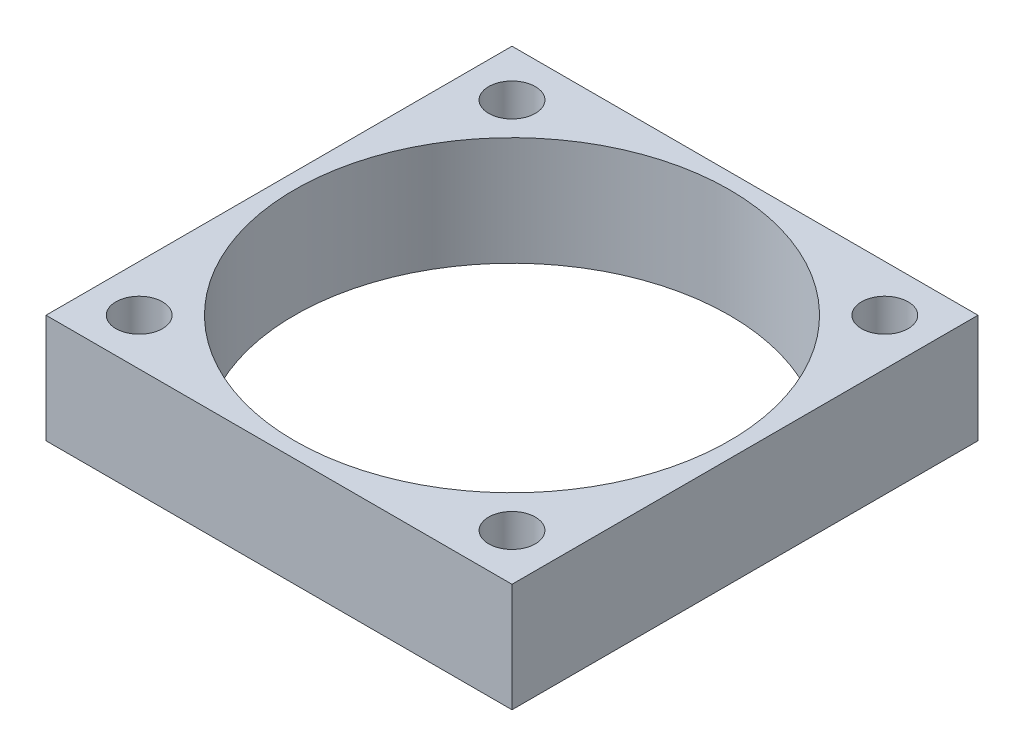
ISO-10303-21;
HEADER;
FILE_DESCRIPTION(('STEP AP214'),'2;1');
FILE_NAME('part.step','',(''),(''),'','','');
FILE_SCHEMA(('AUTOMOTIVE_DESIGN { 1 0 10303 214 1 1 1 1 }'));
ENDSEC;
DATA;
#1=APPLICATION_CONTEXT('core data for automotive mechanical design processes');
#2=APPLICATION_PROTOCOL_DEFINITION('international standard','automotive_design',2000,#1);
#3=PRODUCT_CONTEXT('',#1,'mechanical');
#4=PRODUCT('Part','Part','',(#3));
#5=PRODUCT_RELATED_PRODUCT_CATEGORY('part','',(#4));
#6=PRODUCT_DEFINITION_FORMATION('','',#4);
#7=PRODUCT_DEFINITION_CONTEXT('part definition',#1,'design');
#8=PRODUCT_DEFINITION('design','',#6,#7);
#9=PRODUCT_DEFINITION_SHAPE('','',#8);
#10=(LENGTH_UNIT() NAMED_UNIT(*) SI_UNIT(.MILLI.,.METRE.));
#11=(NAMED_UNIT(*) PLANE_ANGLE_UNIT() SI_UNIT($,.RADIAN.));
#12=(NAMED_UNIT(*) SI_UNIT($,.STERADIAN.) SOLID_ANGLE_UNIT());
#13=UNCERTAINTY_MEASURE_WITH_UNIT(LENGTH_MEASURE(1.E-05),#10,'distance_accuracy_value','');
#14=(GEOMETRIC_REPRESENTATION_CONTEXT(3) GLOBAL_UNCERTAINTY_ASSIGNED_CONTEXT((#13)) GLOBAL_UNIT_ASSIGNED_CONTEXT((#10,
#11,#12)) REPRESENTATION_CONTEXT('',''));
#15=CARTESIAN_POINT('',(0.,0.,0.));
#16=DIRECTION('',(0.,0.,1.));
#17=DIRECTION('',(1.,0.,0.));
#18=AXIS2_PLACEMENT_3D('',#15,#16,#17);
#19=CARTESIAN_POINT('',(0.,7.,0.));
#20=DIRECTION('',(0.,1.,0.));
#21=DIRECTION('',(0.,0.,1.));
#22=AXIS2_PLACEMENT_3D('',#19,#20,#21);
#23=PLANE('',#22);
#24=CARTESIAN_POINT('',(13.1600000000004,7.,11.2399999999996));
#25=DIRECTION('',(0.,1.,0.));
#26=DIRECTION('',(0.,0.,1.));
#27=AXIS2_PLACEMENT_3D('',#24,#25,#26);
#28=CIRCLE('',#27,1.5);
#29=CARTESIAN_POINT('',(13.1600000000004,7.,12.7399999999996));
#30=VERTEX_POINT('',#29);
#31=EDGE_CURVE('E150',#30,#30,#28,.T.);
#32=ORIENTED_EDGE('',*,*,#31,.F.);
#33=EDGE_LOOP('',(#32));
#34=FACE_BOUND('',#33,.T.);
#35=CARTESIAN_POINT('',(1.16,7.,-0.75999999999999));
#36=DIRECTION('',(0.,1.,0.));
#37=DIRECTION('',(0.,0.,1.));
#38=AXIS2_PLACEMENT_3D('',#35,#36,#37);
#39=CIRCLE('',#38,14.);
#40=CARTESIAN_POINT('',(1.16,7.,13.24));
#41=VERTEX_POINT('',#40);
#42=EDGE_CURVE('E134',#41,#41,#39,.T.);
#43=ORIENTED_EDGE('',*,*,#42,.F.);
#44=EDGE_LOOP('',(#43));
#45=FACE_BOUND('',#44,.T.);
#46=DIRECTION('',(0.,0.,1.));
#47=VECTOR('',#46,1.);
#48=CARTESIAN_POINT('',(-13.84,7.,-15.76));
#49=LINE('',#48,#47);
#50=CARTESIAN_POINT('',(-13.84,7.,-15.76));
#51=VERTEX_POINT('',#50);
#52=CARTESIAN_POINT('',(-13.84,7.,14.24));
#53=VERTEX_POINT('',#52);
#54=EDGE_CURVE('E92',#51,#53,#49,.T.);
#55=ORIENTED_EDGE('',*,*,#54,.T.);
#56=DIRECTION('',(1.,0.,0.));
#57=VECTOR('',#56,1.);
#58=CARTESIAN_POINT('',(-13.84,7.,14.24));
#59=LINE('',#58,#57);
#60=CARTESIAN_POINT('',(16.16,7.,14.24));
#61=VERTEX_POINT('',#60);
#62=EDGE_CURVE('E87',#53,#61,#59,.T.);
#63=ORIENTED_EDGE('',*,*,#62,.T.);
#64=DIRECTION('',(0.,0.,-1.));
#65=VECTOR('',#64,1.);
#66=CARTESIAN_POINT('',(16.16,7.,-15.76));
#67=LINE('',#66,#65);
#68=CARTESIAN_POINT('',(16.16,7.,-15.76));
#69=VERTEX_POINT('',#68);
#70=EDGE_CURVE('E90',#61,#69,#67,.T.);
#71=ORIENTED_EDGE('',*,*,#70,.T.);
#72=DIRECTION('',(-1.,0.,0.));
#73=VECTOR('',#72,1.);
#74=CARTESIAN_POINT('',(-13.84,7.,-15.76));
#75=LINE('',#74,#73);
#76=EDGE_CURVE('E57',#69,#51,#75,.T.);
#77=ORIENTED_EDGE('',*,*,#76,.T.);
#78=EDGE_LOOP('',(#55,#63,#71,#77));
#79=FACE_BOUND('',#78,.T.);
#80=CARTESIAN_POINT('',(-10.84,7.,-12.76));
#81=DIRECTION('',(0.,1.,0.));
#82=DIRECTION('',(0.,0.,1.));
#83=AXIS2_PLACEMENT_3D('',#80,#81,#82);
#84=CIRCLE('',#83,1.5);
#85=CARTESIAN_POINT('',(-10.84,7.,-11.26));
#86=VERTEX_POINT('',#85);
#87=EDGE_CURVE('E112',#86,#86,#84,.T.);
#88=ORIENTED_EDGE('',*,*,#87,.F.);
#89=EDGE_LOOP('',(#88));
#90=FACE_BOUND('',#89,.T.);
#91=CARTESIAN_POINT('',(-10.8399999999996,7.,11.2400000000001));
#92=DIRECTION('',(0.,1.,0.));
#93=DIRECTION('',(0.,0.,1.));
#94=AXIS2_PLACEMENT_3D('',#91,#92,#93);
#95=CIRCLE('',#94,1.5);
#96=CARTESIAN_POINT('',(-10.8399999999996,7.,12.7400000000001));
#97=VERTEX_POINT('',#96);
#98=EDGE_CURVE('E142',#97,#97,#95,.T.);
#99=ORIENTED_EDGE('',*,*,#98,.F.);
#100=EDGE_LOOP('',(#99));
#101=FACE_BOUND('',#100,.T.);
#102=CARTESIAN_POINT('',(13.1599999999999,7.,-12.7600000000005));
#103=DIRECTION('',(0.,1.,0.));
#104=DIRECTION('',(0.,0.,1.));
#105=AXIS2_PLACEMENT_3D('',#102,#103,#104);
#106=CIRCLE('',#105,1.5);
#107=CARTESIAN_POINT('',(13.1599999999999,7.,-11.2600000000005));
#108=VERTEX_POINT('',#107);
#109=EDGE_CURVE('E158',#108,#108,#106,.T.);
#110=ORIENTED_EDGE('',*,*,#109,.F.);
#111=EDGE_LOOP('',(#110));
#112=FACE_BOUND('',#111,.T.);
#113=ADVANCED_FACE('F39',(#34,#45,#79,#90,#101,#112),#23,.T.);
#114=CARTESIAN_POINT('',(0.,0.,0.));
#115=DIRECTION('',(0.,1.,0.));
#116=DIRECTION('',(0.,0.,1.));
#117=AXIS2_PLACEMENT_3D('',#114,#115,#116);
#118=PLANE('',#117);
#119=DIRECTION('',(0.,0.,1.));
#120=VECTOR('',#119,1.);
#121=CARTESIAN_POINT('',(-13.84,0.,-15.76));
#122=LINE('',#121,#120);
#123=CARTESIAN_POINT('',(-13.84,0.,-15.76));
#124=VERTEX_POINT('',#123);
#125=CARTESIAN_POINT('',(-13.84,0.,14.24));
#126=VERTEX_POINT('',#125);
#127=EDGE_CURVE('E108',#124,#126,#122,.T.);
#128=ORIENTED_EDGE('',*,*,#127,.F.);
#129=DIRECTION('',(-1.,0.,0.));
#130=VECTOR('',#129,1.);
#131=CARTESIAN_POINT('',(-13.84,0.,-15.76));
#132=LINE('',#131,#130);
#133=CARTESIAN_POINT('',(16.16,0.,-15.76));
#134=VERTEX_POINT('',#133);
#135=EDGE_CURVE('E80',#134,#124,#132,.T.);
#136=ORIENTED_EDGE('',*,*,#135,.F.);
#137=DIRECTION('',(0.,0.,-1.));
#138=VECTOR('',#137,1.);
#139=CARTESIAN_POINT('',(16.16,0.,-15.76));
#140=LINE('',#139,#138);
#141=CARTESIAN_POINT('',(16.16,0.,14.24));
#142=VERTEX_POINT('',#141);
#143=EDGE_CURVE('E74',#142,#134,#140,.T.);
#144=ORIENTED_EDGE('',*,*,#143,.F.);
#145=DIRECTION('',(1.,0.,0.));
#146=VECTOR('',#145,1.);
#147=CARTESIAN_POINT('',(-13.84,0.,14.24));
#148=LINE('',#147,#146);
#149=EDGE_CURVE('E97',#126,#142,#148,.T.);
#150=ORIENTED_EDGE('',*,*,#149,.F.);
#151=EDGE_LOOP('',(#128,#136,#144,#150));
#152=FACE_BOUND('',#151,.T.);
#153=CARTESIAN_POINT('',(-10.84,0.,-12.76));
#154=DIRECTION('',(0.,1.,0.));
#155=DIRECTION('',(0.,0.,1.));
#156=AXIS2_PLACEMENT_3D('',#153,#154,#155);
#157=CIRCLE('',#156,1.5);
#158=CARTESIAN_POINT('',(-10.84,0.,-11.26));
#159=VERTEX_POINT('',#158);
#160=EDGE_CURVE('E130',#159,#159,#157,.T.);
#161=ORIENTED_EDGE('',*,*,#160,.T.);
#162=EDGE_LOOP('',(#161));
#163=FACE_BOUND('',#162,.T.);
#164=CARTESIAN_POINT('',(1.16,0.,-0.75999999999999));
#165=DIRECTION('',(0.,1.,0.));
#166=DIRECTION('',(0.,0.,1.));
#167=AXIS2_PLACEMENT_3D('',#164,#165,#166);
#168=CIRCLE('',#167,14.);
#169=CARTESIAN_POINT('',(1.16,0.,13.24));
#170=VERTEX_POINT('',#169);
#171=EDGE_CURVE('E138',#170,#170,#168,.T.);
#172=ORIENTED_EDGE('',*,*,#171,.T.);
#173=EDGE_LOOP('',(#172));
#174=FACE_BOUND('',#173,.T.);
#175=CARTESIAN_POINT('',(-10.8399999999996,0.,11.2400000000001));
#176=DIRECTION('',(0.,1.,0.));
#177=DIRECTION('',(0.,0.,1.));
#178=AXIS2_PLACEMENT_3D('',#175,#176,#177);
#179=CIRCLE('',#178,1.5);
#180=CARTESIAN_POINT('',(-10.8399999999996,0.,12.7400000000001));
#181=VERTEX_POINT('',#180);
#182=EDGE_CURVE('E146',#181,#181,#179,.T.);
#183=ORIENTED_EDGE('',*,*,#182,.T.);
#184=EDGE_LOOP('',(#183));
#185=FACE_BOUND('',#184,.T.);
#186=CARTESIAN_POINT('',(13.1600000000004,0.,11.2399999999996));
#187=DIRECTION('',(0.,1.,0.));
#188=DIRECTION('',(0.,0.,1.));
#189=AXIS2_PLACEMENT_3D('',#186,#187,#188);
#190=CIRCLE('',#189,1.5);
#191=CARTESIAN_POINT('',(13.1600000000004,0.,12.7399999999996));
#192=VERTEX_POINT('',#191);
#193=EDGE_CURVE('E154',#192,#192,#190,.T.);
#194=ORIENTED_EDGE('',*,*,#193,.T.);
#195=EDGE_LOOP('',(#194));
#196=FACE_BOUND('',#195,.T.);
#197=CARTESIAN_POINT('',(13.1599999999999,0.,-12.7600000000005));
#198=DIRECTION('',(0.,1.,0.));
#199=DIRECTION('',(0.,0.,1.));
#200=AXIS2_PLACEMENT_3D('',#197,#198,#199);
#201=CIRCLE('',#200,1.5);
#202=CARTESIAN_POINT('',(13.1599999999999,0.,-11.2600000000005));
#203=VERTEX_POINT('',#202);
#204=EDGE_CURVE('E162',#203,#203,#201,.T.);
#205=ORIENTED_EDGE('',*,*,#204,.T.);
#206=EDGE_LOOP('',(#205));
#207=FACE_BOUND('',#206,.T.);
#208=ADVANCED_FACE('F125',(#152,#163,#174,#185,#196,#207),#118,.F.);
#209=CARTESIAN_POINT('',(-13.84,7.,-15.76));
#210=DIRECTION('',(1.,0.,0.));
#211=DIRECTION('',(0.,0.,-1.));
#212=AXIS2_PLACEMENT_3D('',#209,#210,#211);
#213=PLANE('',#212);
#214=ORIENTED_EDGE('',*,*,#127,.T.);
#215=DIRECTION('',(0.,-1.,0.));
#216=VECTOR('',#215,1.);
#217=CARTESIAN_POINT('',(-13.84,7.,14.24));
#218=LINE('',#217,#216);
#219=EDGE_CURVE('E11',#53,#126,#218,.T.);
#220=ORIENTED_EDGE('',*,*,#219,.F.);
#221=ORIENTED_EDGE('',*,*,#54,.F.);
#222=DIRECTION('',(0.,-1.,0.));
#223=VECTOR('',#222,1.);
#224=CARTESIAN_POINT('',(-13.84,7.,-15.76));
#225=LINE('',#224,#223);
#226=EDGE_CURVE('E104',#51,#124,#225,.T.);
#227=ORIENTED_EDGE('',*,*,#226,.T.);
#228=EDGE_LOOP('',(#214,#220,#221,#227));
#229=FACE_BOUND('',#228,.T.);
#230=ADVANCED_FACE('F41',(#229),#213,.F.);
#231=CARTESIAN_POINT('',(-13.84,7.,14.24));
#232=DIRECTION('',(0.,0.,-1.));
#233=DIRECTION('',(-1.,0.,0.));
#234=AXIS2_PLACEMENT_3D('',#231,#232,#233);
#235=PLANE('',#234);
#236=ORIENTED_EDGE('',*,*,#149,.T.);
#237=DIRECTION('',(0.,-1.,0.));
#238=VECTOR('',#237,1.);
#239=CARTESIAN_POINT('',(16.16,7.,14.24));
#240=LINE('',#239,#238);
#241=EDGE_CURVE('E49',#61,#142,#240,.T.);
#242=ORIENTED_EDGE('',*,*,#241,.F.);
#243=ORIENTED_EDGE('',*,*,#62,.F.);
#244=ORIENTED_EDGE('',*,*,#219,.T.);
#245=EDGE_LOOP('',(#236,#242,#243,#244));
#246=FACE_BOUND('',#245,.T.);
#247=ADVANCED_FACE('F96',(#246),#235,.F.);
#248=CARTESIAN_POINT('',(16.16,7.,-15.76));
#249=DIRECTION('',(-1.,0.,0.));
#250=DIRECTION('',(0.,0.,1.));
#251=AXIS2_PLACEMENT_3D('',#248,#249,#250);
#252=PLANE('',#251);
#253=ORIENTED_EDGE('',*,*,#143,.T.);
#254=DIRECTION('',(0.,-1.,0.));
#255=VECTOR('',#254,1.);
#256=CARTESIAN_POINT('',(16.16,7.,-15.76));
#257=LINE('',#256,#255);
#258=EDGE_CURVE('E99',#69,#134,#257,.T.);
#259=ORIENTED_EDGE('',*,*,#258,.F.);
#260=ORIENTED_EDGE('',*,*,#70,.F.);
#261=ORIENTED_EDGE('',*,*,#241,.T.);
#262=EDGE_LOOP('',(#253,#259,#260,#261));
#263=FACE_BOUND('',#262,.T.);
#264=ADVANCED_FACE('F100',(#263),#252,.F.);
#265=CARTESIAN_POINT('',(-13.84,7.,-15.76));
#266=DIRECTION('',(0.,0.,1.));
#267=DIRECTION('',(1.,0.,0.));
#268=AXIS2_PLACEMENT_3D('',#265,#266,#267);
#269=PLANE('',#268);
#270=ORIENTED_EDGE('',*,*,#135,.T.);
#271=ORIENTED_EDGE('',*,*,#226,.F.);
#272=ORIENTED_EDGE('',*,*,#76,.F.);
#273=ORIENTED_EDGE('',*,*,#258,.T.);
#274=EDGE_LOOP('',(#270,#271,#272,#273));
#275=FACE_BOUND('',#274,.T.);
#276=ADVANCED_FACE('F122',(#275),#269,.F.);
#277=CARTESIAN_POINT('',(-10.84,7.,-12.76));
#278=DIRECTION('',(0.,-1.,0.));
#279=DIRECTION('',(0.,0.,-1.));
#280=AXIS2_PLACEMENT_3D('',#277,#278,#279);
#281=CYLINDRICAL_SURFACE('',#280,1.5);
#282=ORIENTED_EDGE('',*,*,#87,.T.);
#283=EDGE_LOOP('',(#282));
#284=FACE_BOUND('',#283,.T.);
#285=ORIENTED_EDGE('',*,*,#160,.F.);
#286=EDGE_LOOP('',(#285));
#287=FACE_BOUND('',#286,.T.);
#288=ADVANCED_FACE('F183',(#284,#287),#281,.F.);
#289=CARTESIAN_POINT('',(1.16,7.,-0.75999999999999));
#290=DIRECTION('',(0.,-1.,0.));
#291=DIRECTION('',(0.,0.,-1.));
#292=AXIS2_PLACEMENT_3D('',#289,#290,#291);
#293=CYLINDRICAL_SURFACE('',#292,14.);
#294=ORIENTED_EDGE('',*,*,#42,.T.);
#295=EDGE_LOOP('',(#294));
#296=FACE_BOUND('',#295,.T.);
#297=ORIENTED_EDGE('',*,*,#171,.F.);
#298=EDGE_LOOP('',(#297));
#299=FACE_BOUND('',#298,.T.);
#300=ADVANCED_FACE('F229',(#296,#299),#293,.F.);
#301=CARTESIAN_POINT('',(-10.8399999999996,7.,11.2400000000001));
#302=DIRECTION('',(0.,-1.,0.));
#303=DIRECTION('',(0.,0.,-1.));
#304=AXIS2_PLACEMENT_3D('',#301,#302,#303);
#305=CYLINDRICAL_SURFACE('',#304,1.5);
#306=ORIENTED_EDGE('',*,*,#98,.T.);
#307=EDGE_LOOP('',(#306));
#308=FACE_BOUND('',#307,.T.);
#309=ORIENTED_EDGE('',*,*,#182,.F.);
#310=EDGE_LOOP('',(#309));
#311=FACE_BOUND('',#310,.T.);
#312=ADVANCED_FACE('F237',(#308,#311),#305,.F.);
#313=CARTESIAN_POINT('',(13.1600000000004,7.,11.2399999999996));
#314=DIRECTION('',(0.,-1.,0.));
#315=DIRECTION('',(0.,0.,-1.));
#316=AXIS2_PLACEMENT_3D('',#313,#314,#315);
#317=CYLINDRICAL_SURFACE('',#316,1.5);
#318=ORIENTED_EDGE('',*,*,#31,.T.);
#319=EDGE_LOOP('',(#318));
#320=FACE_BOUND('',#319,.T.);
#321=ORIENTED_EDGE('',*,*,#193,.F.);
#322=EDGE_LOOP('',(#321));
#323=FACE_BOUND('',#322,.T.);
#324=ADVANCED_FACE('F245',(#320,#323),#317,.F.);
#325=CARTESIAN_POINT('',(13.1599999999999,7.,-12.7600000000005));
#326=DIRECTION('',(0.,-1.,0.));
#327=DIRECTION('',(0.,0.,-1.));
#328=AXIS2_PLACEMENT_3D('',#325,#326,#327);
#329=CYLINDRICAL_SURFACE('',#328,1.5);
#330=ORIENTED_EDGE('',*,*,#109,.T.);
#331=EDGE_LOOP('',(#330));
#332=FACE_BOUND('',#331,.T.);
#333=ORIENTED_EDGE('',*,*,#204,.F.);
#334=EDGE_LOOP('',(#333));
#335=FACE_BOUND('',#334,.T.);
#336=ADVANCED_FACE('F170',(#332,#335),#329,.F.);
#337=CLOSED_SHELL('',(#113,#208,#230,#247,#264,#276,#288,#300,#312,#324,#336));
#338=MANIFOLD_SOLID_BREP('B2',#337);
#339=ADVANCED_BREP_SHAPE_REPRESENTATION('',(#18,#338),#14);
#340=SHAPE_DEFINITION_REPRESENTATION(#9,#339);
ENDSEC;
END-ISO-10303-21;
